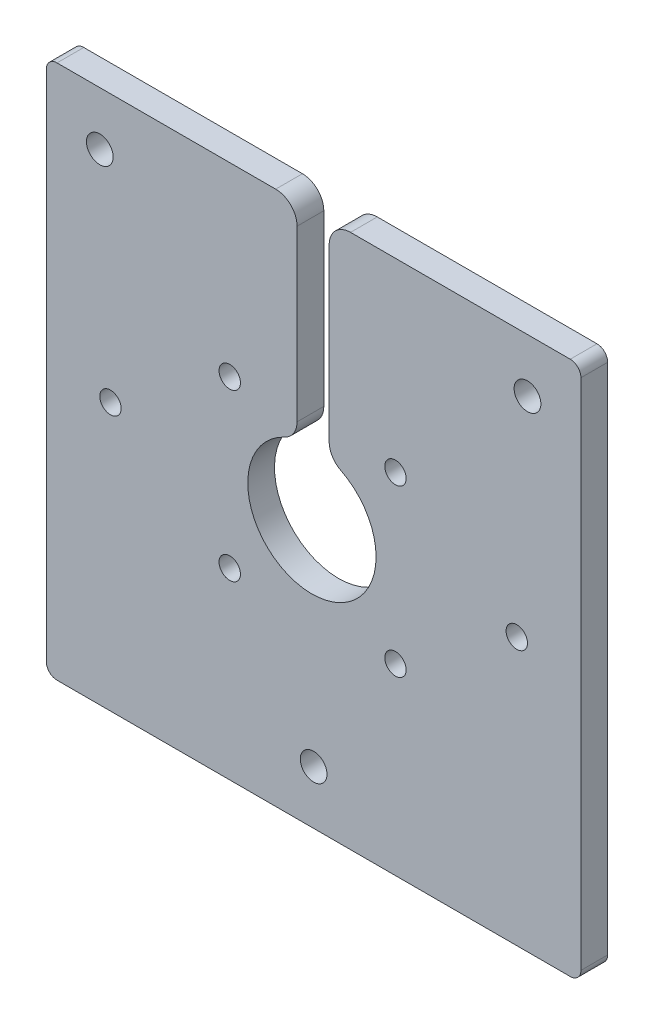
ISO-10303-21;
HEADER;
FILE_DESCRIPTION(('STEP AP214'),'2;1');
FILE_NAME('part.step','',(''),(''),'','','');
FILE_SCHEMA(('AUTOMOTIVE_DESIGN { 1 0 10303 214 1 1 1 1 }'));
ENDSEC;
DATA;
#1=APPLICATION_CONTEXT('core data for automotive mechanical design processes');
#2=APPLICATION_PROTOCOL_DEFINITION('international standard','automotive_design',2000,#1);
#3=PRODUCT_CONTEXT('',#1,'mechanical');
#4=PRODUCT('Part','Part','',(#3));
#5=PRODUCT_RELATED_PRODUCT_CATEGORY('part','',(#4));
#6=PRODUCT_DEFINITION_FORMATION('','',#4);
#7=PRODUCT_DEFINITION_CONTEXT('part definition',#1,'design');
#8=PRODUCT_DEFINITION('design','',#6,#7);
#9=PRODUCT_DEFINITION_SHAPE('','',#8);
#10=(LENGTH_UNIT() NAMED_UNIT(*) SI_UNIT(.MILLI.,.METRE.));
#11=(NAMED_UNIT(*) PLANE_ANGLE_UNIT() SI_UNIT($,.RADIAN.));
#12=(NAMED_UNIT(*) SI_UNIT($,.STERADIAN.) SOLID_ANGLE_UNIT());
#13=UNCERTAINTY_MEASURE_WITH_UNIT(LENGTH_MEASURE(1.E-05),#10,'distance_accuracy_value','');
#14=(GEOMETRIC_REPRESENTATION_CONTEXT(3) GLOBAL_UNCERTAINTY_ASSIGNED_CONTEXT((#13)) GLOBAL_UNIT_ASSIGNED_CONTEXT((#10,
#11,#12)) REPRESENTATION_CONTEXT('',''));
#15=CARTESIAN_POINT('',(0.,0.,0.));
#16=DIRECTION('',(0.,0.,1.));
#17=DIRECTION('',(1.,0.,0.));
#18=AXIS2_PLACEMENT_3D('',#15,#16,#17);
#19=CARTESIAN_POINT('',(95.7197804968145,143.525710145775,706.677889561147));
#20=DIRECTION('',(0.,0.,-1.));
#21=DIRECTION('',(-1.,0.,0.));
#22=AXIS2_PLACEMENT_3D('',#19,#20,#21);
#23=CYLINDRICAL_SURFACE('',#22,4.00000000000002);
#24=CARTESIAN_POINT('',(95.7197804968145,143.525710145775,701.677889561147));
#25=DIRECTION('',(0.,0.,-1.));
#26=DIRECTION('',(-1.,0.,0.));
#27=AXIS2_PLACEMENT_3D('',#24,#25,#26);
#28=CIRCLE('',#27,4.00000000000002);
#29=CARTESIAN_POINT('',(95.7197804968145,147.525710145775,701.677889561147));
#30=VERTEX_POINT('',#29);
#31=CARTESIAN_POINT('',(99.7197804968145,143.525710145775,701.677889561147));
#32=VERTEX_POINT('',#31);
#33=EDGE_CURVE('E178',#30,#32,#28,.T.);
#34=ORIENTED_EDGE('',*,*,#33,.F.);
#35=DIRECTION('',(0.,0.,-1.));
#36=VECTOR('',#35,1.);
#37=CARTESIAN_POINT('',(95.7197804968145,147.525710145775,706.677889561147));
#38=LINE('',#37,#36);
#39=CARTESIAN_POINT('',(95.7197804968145,147.525710145775,706.677889561147));
#40=VERTEX_POINT('',#39);
#41=EDGE_CURVE('E11',#40,#30,#38,.T.);
#42=ORIENTED_EDGE('',*,*,#41,.F.);
#43=CARTESIAN_POINT('',(95.7197804968145,143.525710145775,706.677889561147));
#44=DIRECTION('',(0.,0.,-1.));
#45=DIRECTION('',(-1.,0.,0.));
#46=AXIS2_PLACEMENT_3D('',#43,#44,#45);
#47=CIRCLE('',#46,4.00000000000002);
#48=CARTESIAN_POINT('',(99.7197804968145,143.525710145775,706.677889561147));
#49=VERTEX_POINT('',#48);
#50=EDGE_CURVE('E223',#40,#49,#47,.T.);
#51=ORIENTED_EDGE('',*,*,#50,.T.);
#52=DIRECTION('',(0.,0.,-1.));
#53=VECTOR('',#52,1.);
#54=CARTESIAN_POINT('',(99.7197804968145,143.525710145775,706.677889561147));
#55=LINE('',#54,#53);
#56=EDGE_CURVE('E36',#49,#32,#55,.T.);
#57=ORIENTED_EDGE('',*,*,#56,.T.);
#58=EDGE_LOOP('',(#34,#42,#51,#57));
#59=FACE_BOUND('',#58,.T.);
#60=ADVANCED_FACE('F33',(#59),#23,.T.);
#61=CARTESIAN_POINT('',(54.8160817448117,147.525710145775,706.677889561147));
#62=DIRECTION('',(0.,1.,0.));
#63=DIRECTION('',(-1.,0.,0.));
#64=AXIS2_PLACEMENT_3D('',#61,#62,#63);
#65=PLANE('',#64);
#66=DIRECTION('',(1.,0.,0.));
#67=VECTOR('',#66,1.);
#68=CARTESIAN_POINT('',(54.8160817448117,147.525710145775,701.677889561147));
#69=LINE('',#68,#67);
#70=CARTESIAN_POINT('',(54.8160817448117,147.525710145775,701.677889561147));
#71=VERTEX_POINT('',#70);
#72=EDGE_CURVE('E221',#71,#30,#69,.T.);
#73=ORIENTED_EDGE('',*,*,#72,.F.);
#74=DIRECTION('',(0.,0.,-1.));
#75=VECTOR('',#74,1.);
#76=CARTESIAN_POINT('',(54.8160817448117,147.525710145775,706.677889561147));
#77=LINE('',#76,#75);
#78=CARTESIAN_POINT('',(54.8160817448117,147.525710145775,706.677889561147));
#79=VERTEX_POINT('',#78);
#80=EDGE_CURVE('E42',#79,#71,#77,.T.);
#81=ORIENTED_EDGE('',*,*,#80,.F.);
#82=DIRECTION('',(1.,0.,0.));
#83=VECTOR('',#82,1.);
#84=CARTESIAN_POINT('',(54.8160817448117,147.525710145775,706.677889561147));
#85=LINE('',#84,#83);
#86=EDGE_CURVE('E168',#79,#40,#85,.T.);
#87=ORIENTED_EDGE('',*,*,#86,.T.);
#88=ORIENTED_EDGE('',*,*,#41,.T.);
#89=EDGE_LOOP('',(#73,#81,#87,#88));
#90=FACE_BOUND('',#89,.T.);
#91=ADVANCED_FACE('F251',(#90),#65,.T.);
#92=CARTESIAN_POINT('',(54.8160817448117,145.525710145775,706.677889561147));
#93=DIRECTION('',(0.,0.,-1.));
#94=DIRECTION('',(-1.,0.,0.));
#95=AXIS2_PLACEMENT_3D('',#92,#93,#94);
#96=CYLINDRICAL_SURFACE('',#95,1.99999999999996);
#97=CARTESIAN_POINT('',(54.8160817448117,145.525710145775,701.677889561147));
#98=DIRECTION('',(0.,0.,-1.));
#99=DIRECTION('',(-1.,0.,0.));
#100=AXIS2_PLACEMENT_3D('',#97,#98,#99);
#101=CIRCLE('',#100,1.99999999999996);
#102=CARTESIAN_POINT('',(52.8160817448118,145.525710145775,701.677889561147));
#103=VERTEX_POINT('',#102);
#104=EDGE_CURVE('E155',#103,#71,#101,.T.);
#105=ORIENTED_EDGE('',*,*,#104,.F.);
#106=DIRECTION('',(0.,0.,-1.));
#107=VECTOR('',#106,1.);
#108=CARTESIAN_POINT('',(52.8160817448118,145.525710145775,706.677889561147));
#109=LINE('',#108,#107);
#110=CARTESIAN_POINT('',(52.8160817448118,145.525710145775,706.677889561147));
#111=VERTEX_POINT('',#110);
#112=EDGE_CURVE('E150',#111,#103,#109,.T.);
#113=ORIENTED_EDGE('',*,*,#112,.F.);
#114=CARTESIAN_POINT('',(54.8160817448117,145.525710145775,706.677889561147));
#115=DIRECTION('',(0.,0.,-1.));
#116=DIRECTION('',(-1.,0.,0.));
#117=AXIS2_PLACEMENT_3D('',#114,#115,#116);
#118=CIRCLE('',#117,1.99999999999996);
#119=EDGE_CURVE('E153',#111,#79,#118,.T.);
#120=ORIENTED_EDGE('',*,*,#119,.T.);
#121=ORIENTED_EDGE('',*,*,#80,.T.);
#122=EDGE_LOOP('',(#105,#113,#120,#121));
#123=FACE_BOUND('',#122,.T.);
#124=ADVANCED_FACE('F152',(#123),#96,.T.);
#125=CARTESIAN_POINT('',(52.8160817448118,49.5257101457753,706.677889561147));
#126=DIRECTION('',(-1.,0.,0.));
#127=DIRECTION('',(0.,-1.,0.));
#128=AXIS2_PLACEMENT_3D('',#125,#126,#127);
#129=PLANE('',#128);
#130=DIRECTION('',(0.,1.,0.));
#131=VECTOR('',#130,1.);
#132=CARTESIAN_POINT('',(52.8160817448118,49.5257101457753,701.677889561147));
#133=LINE('',#132,#131);
#134=CARTESIAN_POINT('',(52.8160817448118,49.5257101457753,701.677889561147));
#135=VERTEX_POINT('',#134);
#136=EDGE_CURVE('E218',#135,#103,#133,.T.);
#137=ORIENTED_EDGE('',*,*,#136,.F.);
#138=DIRECTION('',(0.,0.,-1.));
#139=VECTOR('',#138,1.);
#140=CARTESIAN_POINT('',(52.8160817448118,49.5257101457753,706.677889561147));
#141=LINE('',#140,#139);
#142=CARTESIAN_POINT('',(52.8160817448118,49.5257101457753,706.677889561147));
#143=VERTEX_POINT('',#142);
#144=EDGE_CURVE('E160',#143,#135,#141,.T.);
#145=ORIENTED_EDGE('',*,*,#144,.F.);
#146=DIRECTION('',(0.,1.,0.));
#147=VECTOR('',#146,1.);
#148=CARTESIAN_POINT('',(52.8160817448118,49.5257101457753,706.677889561147));
#149=LINE('',#148,#147);
#150=EDGE_CURVE('E166',#143,#111,#149,.T.);
#151=ORIENTED_EDGE('',*,*,#150,.T.);
#152=ORIENTED_EDGE('',*,*,#112,.T.);
#153=EDGE_LOOP('',(#137,#145,#151,#152));
#154=FACE_BOUND('',#153,.T.);
#155=ADVANCED_FACE('F170',(#154),#129,.T.);
#156=CARTESIAN_POINT('',(54.8160817448118,49.5257101457753,706.677889561147));
#157=DIRECTION('',(0.,0.,-1.));
#158=DIRECTION('',(-1.,0.,0.));
#159=AXIS2_PLACEMENT_3D('',#156,#157,#158);
#160=CYLINDRICAL_SURFACE('',#159,2.00000000000007);
#161=CARTESIAN_POINT('',(54.8160817448118,49.5257101457753,701.677889561147));
#162=DIRECTION('',(0.,0.,-1.));
#163=DIRECTION('',(-1.,0.,0.));
#164=AXIS2_PLACEMENT_3D('',#161,#162,#163);
#165=CIRCLE('',#164,2.00000000000007);
#166=CARTESIAN_POINT('',(54.8160817448118,47.5257101457753,701.677889561147));
#167=VERTEX_POINT('',#166);
#168=EDGE_CURVE('E215',#167,#135,#165,.T.);
#169=ORIENTED_EDGE('',*,*,#168,.F.);
#170=DIRECTION('',(0.,0.,-1.));
#171=VECTOR('',#170,1.);
#172=CARTESIAN_POINT('',(54.8160817448118,47.5257101457753,706.677889561147));
#173=LINE('',#172,#171);
#174=CARTESIAN_POINT('',(54.8160817448118,47.5257101457753,706.677889561147));
#175=VERTEX_POINT('',#174);
#176=EDGE_CURVE('E227',#175,#167,#173,.T.);
#177=ORIENTED_EDGE('',*,*,#176,.F.);
#178=CARTESIAN_POINT('',(54.8160817448118,49.5257101457753,706.677889561147));
#179=DIRECTION('',(0.,0.,-1.));
#180=DIRECTION('',(-1.,0.,0.));
#181=AXIS2_PLACEMENT_3D('',#178,#179,#180);
#182=CIRCLE('',#181,2.00000000000007);
#183=EDGE_CURVE('E171',#175,#143,#182,.T.);
#184=ORIENTED_EDGE('',*,*,#183,.T.);
#185=ORIENTED_EDGE('',*,*,#144,.T.);
#186=EDGE_LOOP('',(#169,#177,#184,#185));
#187=FACE_BOUND('',#186,.T.);
#188=ADVANCED_FACE('F264',(#187),#160,.T.);
#189=CARTESIAN_POINT('',(150.816081744812,47.5257101457753,706.677889561147));
#190=DIRECTION('',(0.,-1.,0.));
#191=DIRECTION('',(1.,0.,0.));
#192=AXIS2_PLACEMENT_3D('',#189,#190,#191);
#193=PLANE('',#192);
#194=DIRECTION('',(-1.,0.,0.));
#195=VECTOR('',#194,1.);
#196=CARTESIAN_POINT('',(150.816081744812,47.5257101457753,701.677889561147));
#197=LINE('',#196,#195);
#198=CARTESIAN_POINT('',(150.816081744812,47.5257101457753,701.677889561147));
#199=VERTEX_POINT('',#198);
#200=EDGE_CURVE('E212',#199,#167,#197,.T.);
#201=ORIENTED_EDGE('',*,*,#200,.F.);
#202=DIRECTION('',(0.,0.,-1.));
#203=VECTOR('',#202,1.);
#204=CARTESIAN_POINT('',(150.816081744812,47.5257101457753,706.677889561147));
#205=LINE('',#204,#203);
#206=CARTESIAN_POINT('',(150.816081744812,47.5257101457753,706.677889561147));
#207=VERTEX_POINT('',#206);
#208=EDGE_CURVE('E229',#207,#199,#205,.T.);
#209=ORIENTED_EDGE('',*,*,#208,.F.);
#210=DIRECTION('',(-1.,0.,0.));
#211=VECTOR('',#210,1.);
#212=CARTESIAN_POINT('',(150.816081744812,47.5257101457753,706.677889561147));
#213=LINE('',#212,#211);
#214=EDGE_CURVE('E173',#207,#175,#213,.T.);
#215=ORIENTED_EDGE('',*,*,#214,.T.);
#216=ORIENTED_EDGE('',*,*,#176,.T.);
#217=EDGE_LOOP('',(#201,#209,#215,#216));
#218=FACE_BOUND('',#217,.T.);
#219=ADVANCED_FACE('F267',(#218),#193,.T.);
#220=CARTESIAN_POINT('',(150.816081744812,49.5257101457752,706.677889561147));
#221=DIRECTION('',(0.,0.,-1.));
#222=DIRECTION('',(-1.,0.,0.));
#223=AXIS2_PLACEMENT_3D('',#220,#221,#222);
#224=CYLINDRICAL_SURFACE('',#223,1.99999999999995);
#225=CARTESIAN_POINT('',(150.816081744812,49.5257101457752,701.677889561147));
#226=DIRECTION('',(0.,0.,-1.));
#227=DIRECTION('',(-1.,0.,0.));
#228=AXIS2_PLACEMENT_3D('',#225,#226,#227);
#229=CIRCLE('',#228,1.99999999999995);
#230=CARTESIAN_POINT('',(152.816081744812,49.5257101457752,701.677889561147));
#231=VERTEX_POINT('',#230);
#232=EDGE_CURVE('E209',#231,#199,#229,.T.);
#233=ORIENTED_EDGE('',*,*,#232,.F.);
#234=DIRECTION('',(0.,0.,-1.));
#235=VECTOR('',#234,1.);
#236=CARTESIAN_POINT('',(152.816081744812,49.5257101457752,706.677889561147));
#237=LINE('',#236,#235);
#238=CARTESIAN_POINT('',(152.816081744812,49.5257101457752,706.677889561147));
#239=VERTEX_POINT('',#238);
#240=EDGE_CURVE('E231',#239,#231,#237,.T.);
#241=ORIENTED_EDGE('',*,*,#240,.F.);
#242=CARTESIAN_POINT('',(150.816081744812,49.5257101457752,706.677889561147));
#243=DIRECTION('',(0.,0.,-1.));
#244=DIRECTION('',(-1.,0.,0.));
#245=AXIS2_PLACEMENT_3D('',#242,#243,#244);
#246=CIRCLE('',#245,1.99999999999995);
#247=EDGE_CURVE('E439',#239,#207,#246,.T.);
#248=ORIENTED_EDGE('',*,*,#247,.T.);
#249=ORIENTED_EDGE('',*,*,#208,.T.);
#250=EDGE_LOOP('',(#233,#241,#248,#249));
#251=FACE_BOUND('',#250,.T.);
#252=ADVANCED_FACE('F271',(#251),#224,.T.);
#253=CARTESIAN_POINT('',(152.816081744812,145.525710145775,706.677889561147));
#254=DIRECTION('',(1.,0.,0.));
#255=DIRECTION('',(0.,0.,-1.));
#256=AXIS2_PLACEMENT_3D('',#253,#254,#255);
#257=PLANE('',#256);
#258=DIRECTION('',(0.,-1.,0.));
#259=VECTOR('',#258,1.);
#260=CARTESIAN_POINT('',(152.816081744812,145.525710145775,701.677889561147));
#261=LINE('',#260,#259);
#262=CARTESIAN_POINT('',(152.816081744812,145.525710145775,701.677889561147));
#263=VERTEX_POINT('',#262);
#264=EDGE_CURVE('E206',#263,#231,#261,.T.);
#265=ORIENTED_EDGE('',*,*,#264,.F.);
#266=DIRECTION('',(0.,0.,-1.));
#267=VECTOR('',#266,1.);
#268=CARTESIAN_POINT('',(152.816081744812,145.525710145775,706.677889561147));
#269=LINE('',#268,#267);
#270=CARTESIAN_POINT('',(152.816081744812,145.525710145775,706.677889561147));
#271=VERTEX_POINT('',#270);
#272=EDGE_CURVE('E233',#271,#263,#269,.T.);
#273=ORIENTED_EDGE('',*,*,#272,.F.);
#274=DIRECTION('',(0.,-1.,0.));
#275=VECTOR('',#274,1.);
#276=CARTESIAN_POINT('',(152.816081744812,145.525710145775,706.677889561147));
#277=LINE('',#276,#275);
#278=EDGE_CURVE('E436',#271,#239,#277,.T.);
#279=ORIENTED_EDGE('',*,*,#278,.T.);
#280=ORIENTED_EDGE('',*,*,#240,.T.);
#281=EDGE_LOOP('',(#265,#273,#279,#280));
#282=FACE_BOUND('',#281,.T.);
#283=ADVANCED_FACE('F275',(#282),#257,.T.);
#284=CARTESIAN_POINT('',(150.816081744812,145.525710145775,706.677889561147));
#285=DIRECTION('',(0.,0.,-1.));
#286=DIRECTION('',(-1.,0.,0.));
#287=AXIS2_PLACEMENT_3D('',#284,#285,#286);
#288=CYLINDRICAL_SURFACE('',#287,2.00000000000002);
#289=CARTESIAN_POINT('',(150.816081744812,145.525710145775,701.677889561147));
#290=DIRECTION('',(0.,0.,-1.));
#291=DIRECTION('',(-1.,0.,0.));
#292=AXIS2_PLACEMENT_3D('',#289,#290,#291);
#293=CIRCLE('',#292,2.00000000000002);
#294=CARTESIAN_POINT('',(150.816081744812,147.525710145775,701.677889561147));
#295=VERTEX_POINT('',#294);
#296=EDGE_CURVE('E203',#295,#263,#293,.T.);
#297=ORIENTED_EDGE('',*,*,#296,.F.);
#298=DIRECTION('',(0.,0.,-1.));
#299=VECTOR('',#298,1.);
#300=CARTESIAN_POINT('',(150.816081744812,147.525710145775,706.677889561147));
#301=LINE('',#300,#299);
#302=CARTESIAN_POINT('',(150.816081744812,147.525710145775,706.677889561147));
#303=VERTEX_POINT('',#302);
#304=EDGE_CURVE('E235',#303,#295,#301,.T.);
#305=ORIENTED_EDGE('',*,*,#304,.F.);
#306=CARTESIAN_POINT('',(150.816081744812,145.525710145775,706.677889561147));
#307=DIRECTION('',(0.,0.,-1.));
#308=DIRECTION('',(-1.,0.,0.));
#309=AXIS2_PLACEMENT_3D('',#306,#307,#308);
#310=CIRCLE('',#309,2.00000000000002);
#311=EDGE_CURVE('E433',#303,#271,#310,.T.);
#312=ORIENTED_EDGE('',*,*,#311,.T.);
#313=ORIENTED_EDGE('',*,*,#272,.T.);
#314=EDGE_LOOP('',(#297,#305,#312,#313));
#315=FACE_BOUND('',#314,.T.);
#316=ADVANCED_FACE('F279',(#315),#288,.T.);
#317=CARTESIAN_POINT('',(109.719780496814,147.525710145775,706.677889561147));
#318=DIRECTION('',(0.,1.,0.));
#319=DIRECTION('',(-1.,0.,0.));
#320=AXIS2_PLACEMENT_3D('',#317,#318,#319);
#321=PLANE('',#320);
#322=DIRECTION('',(1.,0.,0.));
#323=VECTOR('',#322,1.);
#324=CARTESIAN_POINT('',(109.719780496814,147.525710145775,701.677889561147));
#325=LINE('',#324,#323);
#326=CARTESIAN_POINT('',(109.719780496814,147.525710145775,701.677889561147));
#327=VERTEX_POINT('',#326);
#328=EDGE_CURVE('E200',#327,#295,#325,.T.);
#329=ORIENTED_EDGE('',*,*,#328,.F.);
#330=DIRECTION('',(0.,0.,-1.));
#331=VECTOR('',#330,1.);
#332=CARTESIAN_POINT('',(109.719780496814,147.525710145775,706.677889561147));
#333=LINE('',#332,#331);
#334=CARTESIAN_POINT('',(109.719780496814,147.525710145775,706.677889561147));
#335=VERTEX_POINT('',#334);
#336=EDGE_CURVE('E237',#335,#327,#333,.T.);
#337=ORIENTED_EDGE('',*,*,#336,.F.);
#338=DIRECTION('',(1.,0.,0.));
#339=VECTOR('',#338,1.);
#340=CARTESIAN_POINT('',(109.719780496814,147.525710145775,706.677889561147));
#341=LINE('',#340,#339);
#342=EDGE_CURVE('E430',#335,#303,#341,.T.);
#343=ORIENTED_EDGE('',*,*,#342,.T.);
#344=ORIENTED_EDGE('',*,*,#304,.T.);
#345=EDGE_LOOP('',(#329,#337,#343,#344));
#346=FACE_BOUND('',#345,.T.);
#347=ADVANCED_FACE('F283',(#346),#321,.T.);
#348=CARTESIAN_POINT('',(109.719780496814,143.525710145775,706.677889561147));
#349=DIRECTION('',(0.,0.,-1.));
#350=DIRECTION('',(-1.,0.,0.));
#351=AXIS2_PLACEMENT_3D('',#348,#349,#350);
#352=CYLINDRICAL_SURFACE('',#351,3.99999999999999);
#353=CARTESIAN_POINT('',(109.719780496814,143.525710145775,701.677889561147));
#354=DIRECTION('',(0.,0.,-1.));
#355=DIRECTION('',(-1.,0.,0.));
#356=AXIS2_PLACEMENT_3D('',#353,#354,#355);
#357=CIRCLE('',#356,3.99999999999999);
#358=CARTESIAN_POINT('',(105.719780496814,143.525710145775,701.677889561147));
#359=VERTEX_POINT('',#358);
#360=EDGE_CURVE('E197',#359,#327,#357,.T.);
#361=ORIENTED_EDGE('',*,*,#360,.F.);
#362=DIRECTION('',(0.,0.,-1.));
#363=VECTOR('',#362,1.);
#364=CARTESIAN_POINT('',(105.719780496814,143.525710145775,706.677889561147));
#365=LINE('',#364,#363);
#366=CARTESIAN_POINT('',(105.719780496814,143.525710145775,706.677889561147));
#367=VERTEX_POINT('',#366);
#368=EDGE_CURVE('E239',#367,#359,#365,.T.);
#369=ORIENTED_EDGE('',*,*,#368,.F.);
#370=CARTESIAN_POINT('',(109.719780496814,143.525710145775,706.677889561147));
#371=DIRECTION('',(0.,0.,-1.));
#372=DIRECTION('',(-1.,0.,0.));
#373=AXIS2_PLACEMENT_3D('',#370,#371,#372);
#374=CIRCLE('',#373,3.99999999999999);
#375=EDGE_CURVE('E427',#367,#335,#374,.T.);
#376=ORIENTED_EDGE('',*,*,#375,.T.);
#377=ORIENTED_EDGE('',*,*,#336,.T.);
#378=EDGE_LOOP('',(#361,#369,#376,#377));
#379=FACE_BOUND('',#378,.T.);
#380=ADVANCED_FACE('F287',(#379),#352,.T.);
#381=CARTESIAN_POINT('',(105.719780496814,111.616874351771,706.677889561147));
#382=DIRECTION('',(-1.,0.,0.));
#383=DIRECTION('',(0.,0.,1.));
#384=AXIS2_PLACEMENT_3D('',#381,#382,#383);
#385=PLANE('',#384);
#386=DIRECTION('',(0.,1.,0.));
#387=VECTOR('',#386,1.);
#388=CARTESIAN_POINT('',(105.719780496814,111.616874351771,701.677889561147));
#389=LINE('',#388,#387);
#390=CARTESIAN_POINT('',(105.719780496814,111.616874351771,701.677889561147));
#391=VERTEX_POINT('',#390);
#392=EDGE_CURVE('E194',#391,#359,#389,.T.);
#393=ORIENTED_EDGE('',*,*,#392,.F.);
#394=DIRECTION('',(0.,0.,-1.));
#395=VECTOR('',#394,1.);
#396=CARTESIAN_POINT('',(105.719780496814,111.616874351771,706.677889561147));
#397=LINE('',#396,#395);
#398=CARTESIAN_POINT('',(105.719780496814,111.616874351771,706.677889561147));
#399=VERTEX_POINT('',#398);
#400=EDGE_CURVE('E241',#399,#391,#397,.T.);
#401=ORIENTED_EDGE('',*,*,#400,.F.);
#402=DIRECTION('',(0.,1.,0.));
#403=VECTOR('',#402,1.);
#404=CARTESIAN_POINT('',(105.719780496814,111.616874351771,706.677889561147));
#405=LINE('',#404,#403);
#406=EDGE_CURVE('E424',#399,#367,#405,.T.);
#407=ORIENTED_EDGE('',*,*,#406,.T.);
#408=ORIENTED_EDGE('',*,*,#368,.T.);
#409=EDGE_LOOP('',(#393,#401,#407,#408));
#410=FACE_BOUND('',#409,.T.);
#411=ADVANCED_FACE('F291',(#410),#385,.T.);
#412=CARTESIAN_POINT('',(109.719780496814,111.616874351771,706.677889561147));
#413=DIRECTION('',(0.,0.,-1.));
#414=DIRECTION('',(-1.,0.,0.));
#415=AXIS2_PLACEMENT_3D('',#412,#413,#414);
#416=CYLINDRICAL_SURFACE('',#415,4.);
#417=CARTESIAN_POINT('',(109.719780496814,111.616874351771,701.677889561147));
#418=DIRECTION('',(0.,0.,-1.));
#419=DIRECTION('',(-1.,0.,0.));
#420=AXIS2_PLACEMENT_3D('',#417,#418,#419);
#421=CIRCLE('',#420,4.);
#422=CARTESIAN_POINT('',(107.914156550073,108.047599612703,701.677889561147));
#423=VERTEX_POINT('',#422);
#424=EDGE_CURVE('E191',#423,#391,#421,.T.);
#425=ORIENTED_EDGE('',*,*,#424,.F.);
#426=DIRECTION('',(0.,0.,-1.));
#427=VECTOR('',#426,1.);
#428=CARTESIAN_POINT('',(107.914156550073,108.047599612703,706.677889561147));
#429=LINE('',#428,#427);
#430=CARTESIAN_POINT('',(107.914156550073,108.047599612703,706.677889561147));
#431=VERTEX_POINT('',#430);
#432=EDGE_CURVE('E243',#431,#423,#429,.T.);
#433=ORIENTED_EDGE('',*,*,#432,.F.);
#434=CARTESIAN_POINT('',(109.719780496814,111.616874351771,706.677889561147));
#435=DIRECTION('',(0.,0.,-1.));
#436=DIRECTION('',(-1.,0.,0.));
#437=AXIS2_PLACEMENT_3D('',#434,#435,#436);
#438=CIRCLE('',#437,4.);
#439=EDGE_CURVE('E421',#431,#399,#438,.T.);
#440=ORIENTED_EDGE('',*,*,#439,.T.);
#441=ORIENTED_EDGE('',*,*,#400,.T.);
#442=EDGE_LOOP('',(#425,#433,#440,#441));
#443=FACE_BOUND('',#442,.T.);
#444=ADVANCED_FACE('F295',(#443),#416,.T.);
#445=CARTESIAN_POINT('',(102.497284709847,97.3397753954974,706.677889561147));
#446=DIRECTION('',(0.,0.,-1.));
#447=DIRECTION('',(-1.,0.,0.));
#448=AXIS2_PLACEMENT_3D('',#445,#446,#447);
#449=CYLINDRICAL_SURFACE('',#448,12.);
#450=CARTESIAN_POINT('',(102.497284709847,97.3397753954974,701.677889561147));
#451=DIRECTION('',(0.,0.,1.));
#452=DIRECTION('',(1.,0.,0.));
#453=AXIS2_PLACEMENT_3D('',#450,#451,#452);
#454=CIRCLE('',#453,12.);
#455=CARTESIAN_POINT('',(97.4141565500726,108.210001157243,701.677889561147));
#456=VERTEX_POINT('',#455);
#457=EDGE_CURVE('E188',#456,#423,#454,.T.);
#458=ORIENTED_EDGE('',*,*,#457,.F.);
#459=DIRECTION('',(0.,0.,-1.));
#460=VECTOR('',#459,1.);
#461=CARTESIAN_POINT('',(97.4141565500726,108.210001157243,706.677889561147));
#462=LINE('',#461,#460);
#463=CARTESIAN_POINT('',(97.4141565500726,108.210001157243,706.677889561147));
#464=VERTEX_POINT('',#463);
#465=EDGE_CURVE('E245',#464,#456,#462,.T.);
#466=ORIENTED_EDGE('',*,*,#465,.F.);
#467=CARTESIAN_POINT('',(102.497284709847,97.3397753954974,706.677889561147));
#468=DIRECTION('',(0.,0.,1.));
#469=DIRECTION('',(1.,0.,0.));
#470=AXIS2_PLACEMENT_3D('',#467,#468,#469);
#471=CIRCLE('',#470,12.);
#472=EDGE_CURVE('E418',#464,#431,#471,.T.);
#473=ORIENTED_EDGE('',*,*,#472,.T.);
#474=ORIENTED_EDGE('',*,*,#432,.T.);
#475=EDGE_LOOP('',(#458,#466,#473,#474));
#476=FACE_BOUND('',#475,.T.);
#477=ADVANCED_FACE('F299',(#476),#449,.F.);
#478=CARTESIAN_POINT('',(95.7197804968144,111.833409744491,706.677889561147));
#479=DIRECTION('',(0.,0.,-1.));
#480=DIRECTION('',(-1.,0.,0.));
#481=AXIS2_PLACEMENT_3D('',#478,#479,#480);
#482=CYLINDRICAL_SURFACE('',#481,4.00000000000002);
#483=CARTESIAN_POINT('',(95.7197804968144,111.833409744491,701.677889561147));
#484=DIRECTION('',(0.,0.,-1.));
#485=DIRECTION('',(-1.,0.,0.));
#486=AXIS2_PLACEMENT_3D('',#483,#484,#485);
#487=CIRCLE('',#486,4.00000000000002);
#488=CARTESIAN_POINT('',(99.7197804968145,111.833409744491,701.677889561147));
#489=VERTEX_POINT('',#488);
#490=EDGE_CURVE('E185',#489,#456,#487,.T.);
#491=ORIENTED_EDGE('',*,*,#490,.F.);
#492=DIRECTION('',(0.,0.,-1.));
#493=VECTOR('',#492,1.);
#494=CARTESIAN_POINT('',(99.7197804968145,111.833409744491,706.677889561147));
#495=LINE('',#494,#493);
#496=CARTESIAN_POINT('',(99.7197804968145,111.833409744491,706.677889561147));
#497=VERTEX_POINT('',#496);
#498=EDGE_CURVE('E246',#497,#489,#495,.T.);
#499=ORIENTED_EDGE('',*,*,#498,.F.);
#500=CARTESIAN_POINT('',(95.7197804968144,111.833409744491,706.677889561147));
#501=DIRECTION('',(0.,0.,-1.));
#502=DIRECTION('',(-1.,0.,0.));
#503=AXIS2_PLACEMENT_3D('',#500,#501,#502);
#504=CIRCLE('',#503,4.00000000000002);
#505=EDGE_CURVE('E415',#497,#464,#504,.T.);
#506=ORIENTED_EDGE('',*,*,#505,.T.);
#507=ORIENTED_EDGE('',*,*,#465,.T.);
#508=EDGE_LOOP('',(#491,#499,#506,#507));
#509=FACE_BOUND('',#508,.T.);
#510=ADVANCED_FACE('F303',(#509),#482,.T.);
#511=CARTESIAN_POINT('',(99.7197804968145,143.525710145775,706.677889561147));
#512=DIRECTION('',(1.,0.,0.));
#513=DIRECTION('',(0.,1.,0.));
#514=AXIS2_PLACEMENT_3D('',#511,#512,#513);
#515=PLANE('',#514);
#516=DIRECTION('',(0.,-1.,0.));
#517=VECTOR('',#516,1.);
#518=CARTESIAN_POINT('',(99.7197804968145,143.525710145775,701.677889561147));
#519=LINE('',#518,#517);
#520=EDGE_CURVE('E181',#32,#489,#519,.T.);
#521=ORIENTED_EDGE('',*,*,#520,.F.);
#522=ORIENTED_EDGE('',*,*,#56,.F.);
#523=DIRECTION('',(0.,-1.,0.));
#524=VECTOR('',#523,1.);
#525=CARTESIAN_POINT('',(99.7197804968145,143.525710145775,706.677889561147));
#526=LINE('',#525,#524);
#527=EDGE_CURVE('E413',#49,#497,#526,.T.);
#528=ORIENTED_EDGE('',*,*,#527,.T.);
#529=ORIENTED_EDGE('',*,*,#498,.T.);
#530=EDGE_LOOP('',(#521,#522,#528,#529));
#531=FACE_BOUND('',#530,.T.);
#532=ADVANCED_FACE('F248',(#531),#515,.T.);
#533=CARTESIAN_POINT('',(95.7197804968145,143.525710145775,706.677889561147));
#534=DIRECTION('',(0.,0.,-1.));
#535=DIRECTION('',(-1.,0.,0.));
#536=AXIS2_PLACEMENT_3D('',#533,#534,#535);
#537=PLANE('',#536);
#538=CARTESIAN_POINT('',(140.816081744812,97.5257101457752,706.677889561147));
#539=DIRECTION('',(0.,0.,-1.));
#540=DIRECTION('',(1.,0.,0.));
#541=AXIS2_PLACEMENT_3D('',#538,#539,#540);
#542=CIRCLE('',#541,2.);
#543=CARTESIAN_POINT('',(142.816081744812,97.5257101457752,706.677889561147));
#544=VERTEX_POINT('',#543);
#545=EDGE_CURVE('E358',#544,#544,#542,.T.);
#546=ORIENTED_EDGE('',*,*,#545,.T.);
#547=EDGE_LOOP('',(#546));
#548=FACE_BOUND('',#547,.T.);
#549=CARTESIAN_POINT('',(64.8160817448118,97.5257101457752,706.677889561147));
#550=DIRECTION('',(0.,0.,-1.));
#551=DIRECTION('',(1.,0.,0.));
#552=AXIS2_PLACEMENT_3D('',#549,#550,#551);
#553=CIRCLE('',#552,2.);
#554=CARTESIAN_POINT('',(66.8160817448118,97.5257101457752,706.677889561147));
#555=VERTEX_POINT('',#554);
#556=EDGE_CURVE('E366',#555,#555,#553,.T.);
#557=ORIENTED_EDGE('',*,*,#556,.T.);
#558=EDGE_LOOP('',(#557));
#559=FACE_BOUND('',#558,.T.);
#560=CARTESIAN_POINT('',(142.816081744812,137.525710145775,706.677889561147));
#561=DIRECTION('',(0.,0.,-1.));
#562=DIRECTION('',(1.,0.,0.));
#563=AXIS2_PLACEMENT_3D('',#560,#561,#562);
#564=CIRCLE('',#563,2.5);
#565=CARTESIAN_POINT('',(145.316081744812,137.525710145775,706.677889561147));
#566=VERTEX_POINT('',#565);
#567=EDGE_CURVE('E372',#566,#566,#564,.T.);
#568=ORIENTED_EDGE('',*,*,#567,.T.);
#569=EDGE_LOOP('',(#568));
#570=FACE_BOUND('',#569,.T.);
#571=CARTESIAN_POINT('',(62.8160817448118,137.525710145775,706.677889561147));
#572=DIRECTION('',(0.,0.,-1.));
#573=DIRECTION('',(1.,0.,0.));
#574=AXIS2_PLACEMENT_3D('',#571,#572,#573);
#575=CIRCLE('',#574,2.5);
#576=CARTESIAN_POINT('',(65.3160817448118,137.525710145775,706.677889561147));
#577=VERTEX_POINT('',#576);
#578=EDGE_CURVE('E378',#577,#577,#575,.T.);
#579=ORIENTED_EDGE('',*,*,#578,.T.);
#580=EDGE_LOOP('',(#579));
#581=FACE_BOUND('',#580,.T.);
#582=CARTESIAN_POINT('',(102.816081744812,57.5257101457752,706.677889561147));
#583=DIRECTION('',(0.,0.,-1.));
#584=DIRECTION('',(1.,0.,0.));
#585=AXIS2_PLACEMENT_3D('',#582,#583,#584);
#586=CIRCLE('',#585,2.5);
#587=CARTESIAN_POINT('',(105.316081744812,57.5257101457752,706.677889561147));
#588=VERTEX_POINT('',#587);
#589=EDGE_CURVE('E384',#588,#588,#586,.T.);
#590=ORIENTED_EDGE('',*,*,#589,.T.);
#591=EDGE_LOOP('',(#590));
#592=FACE_BOUND('',#591,.T.);
#593=CARTESIAN_POINT('',(118.123479248816,112.839775395497,706.677889561147));
#594=DIRECTION('',(0.,0.,-1.));
#595=DIRECTION('',(1.,0.,0.));
#596=AXIS2_PLACEMENT_3D('',#593,#594,#595);
#597=CIRCLE('',#596,2.);
#598=CARTESIAN_POINT('',(120.123479248816,112.839775395497,706.677889561147));
#599=VERTEX_POINT('',#598);
#600=EDGE_CURVE('E390',#599,#599,#597,.T.);
#601=ORIENTED_EDGE('',*,*,#600,.T.);
#602=EDGE_LOOP('',(#601));
#603=FACE_BOUND('',#602,.T.);
#604=CARTESIAN_POINT('',(87.1234792488157,112.839775395497,706.677889561147));
#605=DIRECTION('',(0.,0.,-1.));
#606=DIRECTION('',(1.,0.,0.));
#607=AXIS2_PLACEMENT_3D('',#604,#605,#606);
#608=CIRCLE('',#607,2.);
#609=CARTESIAN_POINT('',(89.1234792488157,112.839775395497,706.677889561147));
#610=VERTEX_POINT('',#609);
#611=EDGE_CURVE('E396',#610,#610,#608,.T.);
#612=ORIENTED_EDGE('',*,*,#611,.T.);
#613=EDGE_LOOP('',(#612));
#614=FACE_BOUND('',#613,.T.);
#615=CARTESIAN_POINT('',(118.123479248816,81.8397753954974,706.677889561147));
#616=DIRECTION('',(0.,0.,-1.));
#617=DIRECTION('',(1.,0.,0.));
#618=AXIS2_PLACEMENT_3D('',#615,#616,#617);
#619=CIRCLE('',#618,2.);
#620=CARTESIAN_POINT('',(120.123479248816,81.8397753954974,706.677889561147));
#621=VERTEX_POINT('',#620);
#622=EDGE_CURVE('E402',#621,#621,#619,.T.);
#623=ORIENTED_EDGE('',*,*,#622,.T.);
#624=EDGE_LOOP('',(#623));
#625=FACE_BOUND('',#624,.T.);
#626=CARTESIAN_POINT('',(87.1234792488157,81.8397753954974,706.677889561147));
#627=DIRECTION('',(0.,0.,-1.));
#628=DIRECTION('',(1.,0.,0.));
#629=AXIS2_PLACEMENT_3D('',#626,#627,#628);
#630=CIRCLE('',#629,2.);
#631=CARTESIAN_POINT('',(89.1234792488157,81.8397753954974,706.677889561147));
#632=VERTEX_POINT('',#631);
#633=EDGE_CURVE('E182',#632,#632,#630,.T.);
#634=ORIENTED_EDGE('',*,*,#633,.T.);
#635=EDGE_LOOP('',(#634));
#636=FACE_BOUND('',#635,.T.);
#637=ORIENTED_EDGE('',*,*,#50,.F.);
#638=ORIENTED_EDGE('',*,*,#86,.F.);
#639=ORIENTED_EDGE('',*,*,#119,.F.);
#640=ORIENTED_EDGE('',*,*,#150,.F.);
#641=ORIENTED_EDGE('',*,*,#183,.F.);
#642=ORIENTED_EDGE('',*,*,#214,.F.);
#643=ORIENTED_EDGE('',*,*,#247,.F.);
#644=ORIENTED_EDGE('',*,*,#278,.F.);
#645=ORIENTED_EDGE('',*,*,#311,.F.);
#646=ORIENTED_EDGE('',*,*,#342,.F.);
#647=ORIENTED_EDGE('',*,*,#375,.F.);
#648=ORIENTED_EDGE('',*,*,#406,.F.);
#649=ORIENTED_EDGE('',*,*,#439,.F.);
#650=ORIENTED_EDGE('',*,*,#472,.F.);
#651=ORIENTED_EDGE('',*,*,#505,.F.);
#652=ORIENTED_EDGE('',*,*,#527,.F.);
#653=EDGE_LOOP('',(#637,#638,#639,#640,#641,#642,#643,#644,#645,#646,#647,#648,#649,#650,#651,#652));
#654=FACE_BOUND('',#653,.T.);
#655=ADVANCED_FACE('F164',(#548,#559,#570,#581,#592,#603,#614,#625,#636,#654),#537,.F.);
#656=CARTESIAN_POINT('',(95.7197804968145,143.525710145775,701.677889561147));
#657=DIRECTION('',(0.,0.,-1.));
#658=DIRECTION('',(-1.,0.,0.));
#659=AXIS2_PLACEMENT_3D('',#656,#657,#658);
#660=PLANE('',#659);
#661=CARTESIAN_POINT('',(140.816081744812,97.5257101457752,701.677889561147));
#662=DIRECTION('',(0.,0.,-1.));
#663=DIRECTION('',(1.,0.,0.));
#664=AXIS2_PLACEMENT_3D('',#661,#662,#663);
#665=CIRCLE('',#664,2.);
#666=CARTESIAN_POINT('',(142.816081744812,97.5257101457752,701.677889561147));
#667=VERTEX_POINT('',#666);
#668=EDGE_CURVE('E361',#667,#667,#665,.T.);
#669=ORIENTED_EDGE('',*,*,#668,.F.);
#670=EDGE_LOOP('',(#669));
#671=FACE_BOUND('',#670,.T.);
#672=CARTESIAN_POINT('',(64.8160817448118,97.5257101457752,701.677889561147));
#673=DIRECTION('',(0.,0.,-1.));
#674=DIRECTION('',(1.,0.,0.));
#675=AXIS2_PLACEMENT_3D('',#672,#673,#674);
#676=CIRCLE('',#675,2.);
#677=CARTESIAN_POINT('',(66.8160817448118,97.5257101457752,701.677889561147));
#678=VERTEX_POINT('',#677);
#679=EDGE_CURVE('E363',#678,#678,#676,.T.);
#680=ORIENTED_EDGE('',*,*,#679,.F.);
#681=EDGE_LOOP('',(#680));
#682=FACE_BOUND('',#681,.T.);
#683=CARTESIAN_POINT('',(142.816081744812,137.525710145775,701.677889561147));
#684=DIRECTION('',(0.,0.,-1.));
#685=DIRECTION('',(1.,0.,0.));
#686=AXIS2_PLACEMENT_3D('',#683,#684,#685);
#687=CIRCLE('',#686,2.5);
#688=CARTESIAN_POINT('',(145.316081744812,137.525710145775,701.677889561147));
#689=VERTEX_POINT('',#688);
#690=EDGE_CURVE('E369',#689,#689,#687,.T.);
#691=ORIENTED_EDGE('',*,*,#690,.F.);
#692=EDGE_LOOP('',(#691));
#693=FACE_BOUND('',#692,.T.);
#694=CARTESIAN_POINT('',(62.8160817448118,137.525710145775,701.677889561147));
#695=DIRECTION('',(0.,0.,-1.));
#696=DIRECTION('',(1.,0.,0.));
#697=AXIS2_PLACEMENT_3D('',#694,#695,#696);
#698=CIRCLE('',#697,2.5);
#699=CARTESIAN_POINT('',(65.3160817448118,137.525710145775,701.677889561147));
#700=VERTEX_POINT('',#699);
#701=EDGE_CURVE('E375',#700,#700,#698,.T.);
#702=ORIENTED_EDGE('',*,*,#701,.F.);
#703=EDGE_LOOP('',(#702));
#704=FACE_BOUND('',#703,.T.);
#705=CARTESIAN_POINT('',(102.816081744812,57.5257101457752,701.677889561147));
#706=DIRECTION('',(0.,0.,-1.));
#707=DIRECTION('',(1.,0.,0.));
#708=AXIS2_PLACEMENT_3D('',#705,#706,#707);
#709=CIRCLE('',#708,2.5);
#710=CARTESIAN_POINT('',(105.316081744812,57.5257101457752,701.677889561147));
#711=VERTEX_POINT('',#710);
#712=EDGE_CURVE('E381',#711,#711,#709,.T.);
#713=ORIENTED_EDGE('',*,*,#712,.F.);
#714=EDGE_LOOP('',(#713));
#715=FACE_BOUND('',#714,.T.);
#716=CARTESIAN_POINT('',(118.123479248816,112.839775395497,701.677889561147));
#717=DIRECTION('',(0.,0.,-1.));
#718=DIRECTION('',(1.,0.,0.));
#719=AXIS2_PLACEMENT_3D('',#716,#717,#718);
#720=CIRCLE('',#719,2.);
#721=CARTESIAN_POINT('',(120.123479248816,112.839775395497,701.677889561147));
#722=VERTEX_POINT('',#721);
#723=EDGE_CURVE('E387',#722,#722,#720,.T.);
#724=ORIENTED_EDGE('',*,*,#723,.F.);
#725=EDGE_LOOP('',(#724));
#726=FACE_BOUND('',#725,.T.);
#727=CARTESIAN_POINT('',(87.1234792488157,112.839775395497,701.677889561147));
#728=DIRECTION('',(0.,0.,-1.));
#729=DIRECTION('',(1.,0.,0.));
#730=AXIS2_PLACEMENT_3D('',#727,#728,#729);
#731=CIRCLE('',#730,2.);
#732=CARTESIAN_POINT('',(89.1234792488157,112.839775395497,701.677889561147));
#733=VERTEX_POINT('',#732);
#734=EDGE_CURVE('E393',#733,#733,#731,.T.);
#735=ORIENTED_EDGE('',*,*,#734,.F.);
#736=EDGE_LOOP('',(#735));
#737=FACE_BOUND('',#736,.T.);
#738=CARTESIAN_POINT('',(118.123479248816,81.8397753954974,701.677889561147));
#739=DIRECTION('',(0.,0.,-1.));
#740=DIRECTION('',(1.,0.,0.));
#741=AXIS2_PLACEMENT_3D('',#738,#739,#740);
#742=CIRCLE('',#741,2.);
#743=CARTESIAN_POINT('',(120.123479248816,81.8397753954974,701.677889561147));
#744=VERTEX_POINT('',#743);
#745=EDGE_CURVE('E399',#744,#744,#742,.T.);
#746=ORIENTED_EDGE('',*,*,#745,.F.);
#747=EDGE_LOOP('',(#746));
#748=FACE_BOUND('',#747,.T.);
#749=CARTESIAN_POINT('',(87.1234792488157,81.8397753954974,701.677889561147));
#750=DIRECTION('',(0.,0.,-1.));
#751=DIRECTION('',(1.,0.,0.));
#752=AXIS2_PLACEMENT_3D('',#749,#750,#751);
#753=CIRCLE('',#752,2.);
#754=CARTESIAN_POINT('',(89.1234792488157,81.8397753954974,701.677889561147));
#755=VERTEX_POINT('',#754);
#756=EDGE_CURVE('E405',#755,#755,#753,.T.);
#757=ORIENTED_EDGE('',*,*,#756,.F.);
#758=EDGE_LOOP('',(#757));
#759=FACE_BOUND('',#758,.T.);
#760=ORIENTED_EDGE('',*,*,#33,.T.);
#761=ORIENTED_EDGE('',*,*,#520,.T.);
#762=ORIENTED_EDGE('',*,*,#490,.T.);
#763=ORIENTED_EDGE('',*,*,#457,.T.);
#764=ORIENTED_EDGE('',*,*,#424,.T.);
#765=ORIENTED_EDGE('',*,*,#392,.T.);
#766=ORIENTED_EDGE('',*,*,#360,.T.);
#767=ORIENTED_EDGE('',*,*,#328,.T.);
#768=ORIENTED_EDGE('',*,*,#296,.T.);
#769=ORIENTED_EDGE('',*,*,#264,.T.);
#770=ORIENTED_EDGE('',*,*,#232,.T.);
#771=ORIENTED_EDGE('',*,*,#200,.T.);
#772=ORIENTED_EDGE('',*,*,#168,.T.);
#773=ORIENTED_EDGE('',*,*,#136,.T.);
#774=ORIENTED_EDGE('',*,*,#104,.T.);
#775=ORIENTED_EDGE('',*,*,#72,.T.);
#776=EDGE_LOOP('',(#760,#761,#762,#763,#764,#765,#766,#767,#768,#769,#770,#771,#772,#773,#774,#775));
#777=FACE_BOUND('',#776,.T.);
#778=ADVANCED_FACE('F250',(#671,#682,#693,#704,#715,#726,#737,#748,#759,#777),#660,.T.);
#779=CARTESIAN_POINT('',(87.1234792488157,81.8397753954974,706.677889561147));
#780=DIRECTION('',(0.,0.,-1.));
#781=DIRECTION('',(-1.,0.,0.));
#782=AXIS2_PLACEMENT_3D('',#779,#780,#781);
#783=CYLINDRICAL_SURFACE('',#782,2.);
#784=ORIENTED_EDGE('',*,*,#633,.F.);
#785=EDGE_LOOP('',(#784));
#786=FACE_BOUND('',#785,.T.);
#787=ORIENTED_EDGE('',*,*,#756,.T.);
#788=EDGE_LOOP('',(#787));
#789=FACE_BOUND('',#788,.T.);
#790=ADVANCED_FACE('F315',(#786,#789),#783,.F.);
#791=CARTESIAN_POINT('',(118.123479248816,81.8397753954974,706.677889561147));
#792=DIRECTION('',(0.,0.,-1.));
#793=DIRECTION('',(-1.,0.,0.));
#794=AXIS2_PLACEMENT_3D('',#791,#792,#793);
#795=CYLINDRICAL_SURFACE('',#794,2.);
#796=ORIENTED_EDGE('',*,*,#622,.F.);
#797=EDGE_LOOP('',(#796));
#798=FACE_BOUND('',#797,.T.);
#799=ORIENTED_EDGE('',*,*,#745,.T.);
#800=EDGE_LOOP('',(#799));
#801=FACE_BOUND('',#800,.T.);
#802=ADVANCED_FACE('F322',(#798,#801),#795,.F.);
#803=CARTESIAN_POINT('',(87.1234792488157,112.839775395497,706.677889561147));
#804=DIRECTION('',(0.,0.,-1.));
#805=DIRECTION('',(-1.,0.,0.));
#806=AXIS2_PLACEMENT_3D('',#803,#804,#805);
#807=CYLINDRICAL_SURFACE('',#806,2.);
#808=ORIENTED_EDGE('',*,*,#611,.F.);
#809=EDGE_LOOP('',(#808));
#810=FACE_BOUND('',#809,.T.);
#811=ORIENTED_EDGE('',*,*,#734,.T.);
#812=EDGE_LOOP('',(#811));
#813=FACE_BOUND('',#812,.T.);
#814=ADVANCED_FACE('F326',(#810,#813),#807,.F.);
#815=CARTESIAN_POINT('',(118.123479248816,112.839775395497,706.677889561147));
#816=DIRECTION('',(0.,0.,-1.));
#817=DIRECTION('',(-1.,0.,0.));
#818=AXIS2_PLACEMENT_3D('',#815,#816,#817);
#819=CYLINDRICAL_SURFACE('',#818,2.);
#820=ORIENTED_EDGE('',*,*,#600,.F.);
#821=EDGE_LOOP('',(#820));
#822=FACE_BOUND('',#821,.T.);
#823=ORIENTED_EDGE('',*,*,#723,.T.);
#824=EDGE_LOOP('',(#823));
#825=FACE_BOUND('',#824,.T.);
#826=ADVANCED_FACE('F330',(#822,#825),#819,.F.);
#827=CARTESIAN_POINT('',(102.816081744812,57.5257101457752,706.677889561147));
#828=DIRECTION('',(0.,0.,-1.));
#829=DIRECTION('',(-1.,0.,0.));
#830=AXIS2_PLACEMENT_3D('',#827,#828,#829);
#831=CYLINDRICAL_SURFACE('',#830,2.5);
#832=ORIENTED_EDGE('',*,*,#589,.F.);
#833=EDGE_LOOP('',(#832));
#834=FACE_BOUND('',#833,.T.);
#835=ORIENTED_EDGE('',*,*,#712,.T.);
#836=EDGE_LOOP('',(#835));
#837=FACE_BOUND('',#836,.T.);
#838=ADVANCED_FACE('F334',(#834,#837),#831,.F.);
#839=CARTESIAN_POINT('',(62.8160817448118,137.525710145775,706.677889561147));
#840=DIRECTION('',(0.,0.,-1.));
#841=DIRECTION('',(-1.,0.,0.));
#842=AXIS2_PLACEMENT_3D('',#839,#840,#841);
#843=CYLINDRICAL_SURFACE('',#842,2.5);
#844=ORIENTED_EDGE('',*,*,#578,.F.);
#845=EDGE_LOOP('',(#844));
#846=FACE_BOUND('',#845,.T.);
#847=ORIENTED_EDGE('',*,*,#701,.T.);
#848=EDGE_LOOP('',(#847));
#849=FACE_BOUND('',#848,.T.);
#850=ADVANCED_FACE('F338',(#846,#849),#843,.F.);
#851=CARTESIAN_POINT('',(142.816081744812,137.525710145775,706.677889561147));
#852=DIRECTION('',(0.,0.,-1.));
#853=DIRECTION('',(-1.,0.,0.));
#854=AXIS2_PLACEMENT_3D('',#851,#852,#853);
#855=CYLINDRICAL_SURFACE('',#854,2.5);
#856=ORIENTED_EDGE('',*,*,#567,.F.);
#857=EDGE_LOOP('',(#856));
#858=FACE_BOUND('',#857,.T.);
#859=ORIENTED_EDGE('',*,*,#690,.T.);
#860=EDGE_LOOP('',(#859));
#861=FACE_BOUND('',#860,.T.);
#862=ADVANCED_FACE('F342',(#858,#861),#855,.F.);
#863=CARTESIAN_POINT('',(64.8160817448118,97.5257101457752,706.677889561147));
#864=DIRECTION('',(0.,0.,-1.));
#865=DIRECTION('',(-1.,0.,0.));
#866=AXIS2_PLACEMENT_3D('',#863,#864,#865);
#867=CYLINDRICAL_SURFACE('',#866,2.);
#868=ORIENTED_EDGE('',*,*,#556,.F.);
#869=EDGE_LOOP('',(#868));
#870=FACE_BOUND('',#869,.T.);
#871=ORIENTED_EDGE('',*,*,#679,.T.);
#872=EDGE_LOOP('',(#871));
#873=FACE_BOUND('',#872,.T.);
#874=ADVANCED_FACE('F346',(#870,#873),#867,.F.);
#875=CARTESIAN_POINT('',(140.816081744812,97.5257101457752,706.677889561147));
#876=DIRECTION('',(0.,0.,-1.));
#877=DIRECTION('',(-1.,0.,0.));
#878=AXIS2_PLACEMENT_3D('',#875,#876,#877);
#879=CYLINDRICAL_SURFACE('',#878,2.);
#880=ORIENTED_EDGE('',*,*,#545,.F.);
#881=EDGE_LOOP('',(#880));
#882=FACE_BOUND('',#881,.T.);
#883=ORIENTED_EDGE('',*,*,#668,.T.);
#884=EDGE_LOOP('',(#883));
#885=FACE_BOUND('',#884,.T.);
#886=ADVANCED_FACE('F350',(#882,#885),#879,.F.);
#887=CLOSED_SHELL('',(#60,#91,#124,#155,#188,#219,#252,#283,#316,#347,#380,#411,#444,#477,#510,
#532,#655,#778,#790,#802,#814,#826,#838,#850,#862,#874,#886));
#888=MANIFOLD_SOLID_BREP('B2',#887);
#889=ADVANCED_BREP_SHAPE_REPRESENTATION('',(#18,#888),#14);
#890=SHAPE_DEFINITION_REPRESENTATION(#9,#889);
ENDSEC;
END-ISO-10303-21;
